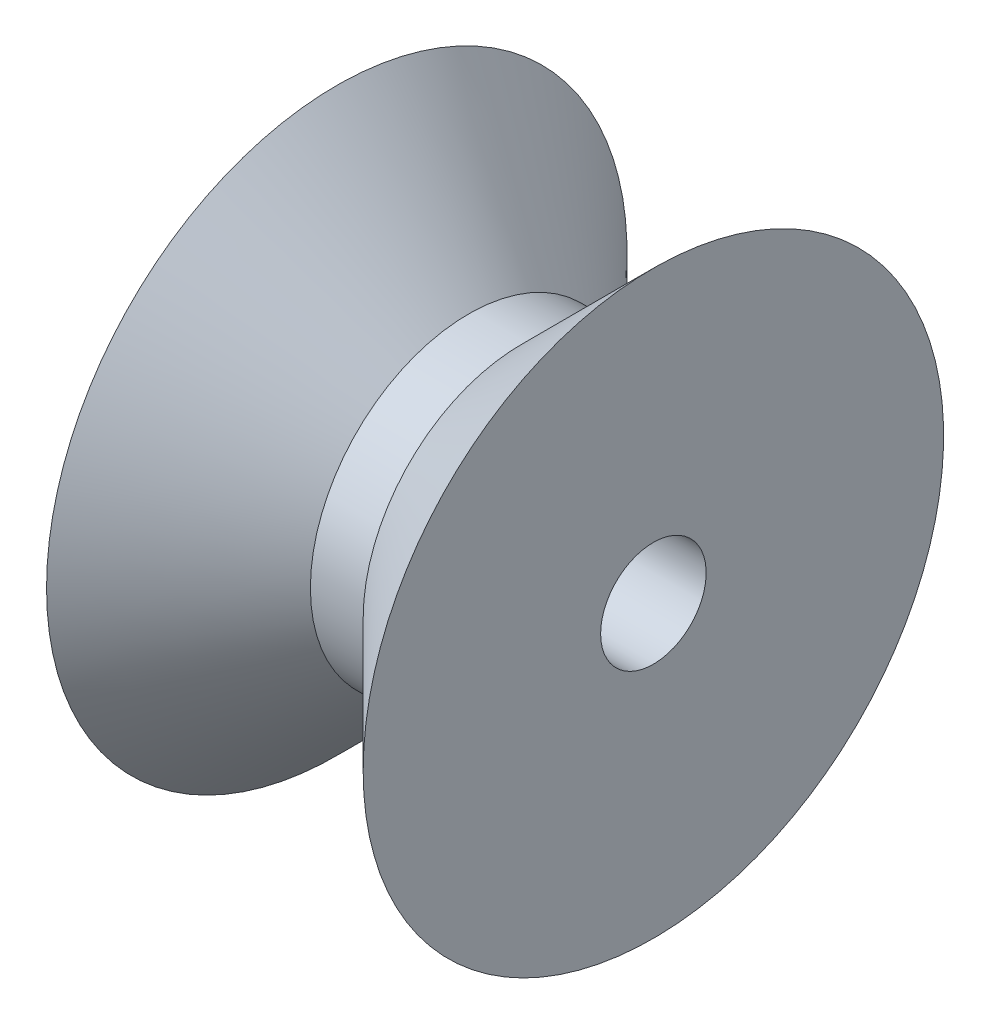
ISO-10303-21;
HEADER;
FILE_DESCRIPTION(('STEP AP214'),'2;1');
FILE_NAME('part.step','',(''),(''),'','','');
FILE_SCHEMA(('AUTOMOTIVE_DESIGN { 1 0 10303 214 1 1 1 1 }'));
ENDSEC;
DATA;
#1=APPLICATION_CONTEXT('core data for automotive mechanical design processes');
#2=APPLICATION_PROTOCOL_DEFINITION('international standard','automotive_design',2000,#1);
#3=PRODUCT_CONTEXT('',#1,'mechanical');
#4=PRODUCT('Part','Part','',(#3));
#5=PRODUCT_RELATED_PRODUCT_CATEGORY('part','',(#4));
#6=PRODUCT_DEFINITION_FORMATION('','',#4);
#7=PRODUCT_DEFINITION_CONTEXT('part definition',#1,'design');
#8=PRODUCT_DEFINITION('design','',#6,#7);
#9=PRODUCT_DEFINITION_SHAPE('','',#8);
#10=(LENGTH_UNIT() NAMED_UNIT(*) SI_UNIT(.MILLI.,.METRE.));
#11=(NAMED_UNIT(*) PLANE_ANGLE_UNIT() SI_UNIT($,.RADIAN.));
#12=(NAMED_UNIT(*) SI_UNIT($,.STERADIAN.) SOLID_ANGLE_UNIT());
#13=UNCERTAINTY_MEASURE_WITH_UNIT(LENGTH_MEASURE(1.E-05),#10,'distance_accuracy_value','');
#14=(GEOMETRIC_REPRESENTATION_CONTEXT(3) GLOBAL_UNCERTAINTY_ASSIGNED_CONTEXT((#13)) GLOBAL_UNIT_ASSIGNED_CONTEXT((#10,
#11,#12)) REPRESENTATION_CONTEXT('',''));
#15=CARTESIAN_POINT('',(0.,0.,0.));
#16=DIRECTION('',(0.,0.,1.));
#17=DIRECTION('',(1.,0.,0.));
#18=AXIS2_PLACEMENT_3D('',#15,#16,#17);
#19=CARTESIAN_POINT('',(6.,0.,0.));
#20=DIRECTION('',(-1.,0.,0.));
#21=DIRECTION('',(0.,0.,1.));
#22=AXIS2_PLACEMENT_3D('',#19,#20,#21);
#23=PLANE('',#22);
#24=CARTESIAN_POINT('',(6.,0.,0.));
#25=DIRECTION('',(-1.,0.,0.));
#26=DIRECTION('',(0.,0.,1.));
#27=AXIS2_PLACEMENT_3D('',#24,#25,#26);
#28=CIRCLE('',#27,2.);
#29=CARTESIAN_POINT('',(6.,0.,2.));
#30=VERTEX_POINT('',#29);
#31=EDGE_CURVE('E50',#30,#30,#28,.T.);
#32=ORIENTED_EDGE('',*,*,#31,.T.);
#33=EDGE_LOOP('',(#32));
#34=FACE_BOUND('',#33,.T.);
#35=CARTESIAN_POINT('',(6.,0.,0.));
#36=DIRECTION('',(-1.,0.,0.));
#37=DIRECTION('',(0.,0.,1.));
#38=AXIS2_PLACEMENT_3D('',#35,#36,#37);
#39=CIRCLE('',#38,11.);
#40=CARTESIAN_POINT('',(6.,0.,11.));
#41=VERTEX_POINT('',#40);
#42=EDGE_CURVE('E45',#41,#41,#39,.T.);
#43=ORIENTED_EDGE('',*,*,#42,.F.);
#44=EDGE_LOOP('',(#43));
#45=FACE_BOUND('',#44,.T.);
#46=ADVANCED_FACE('F31',(#34,#45),#23,.F.);
#47=CARTESIAN_POINT('',(-6.,0.,0.));
#48=DIRECTION('',(-1.,0.,0.));
#49=DIRECTION('',(0.,0.,1.));
#50=AXIS2_PLACEMENT_3D('',#47,#48,#49);
#51=PLANE('',#50);
#52=CARTESIAN_POINT('',(-6.,0.,0.));
#53=DIRECTION('',(-1.,0.,0.));
#54=DIRECTION('',(0.,0.,1.));
#55=AXIS2_PLACEMENT_3D('',#52,#53,#54);
#56=CIRCLE('',#55,2.);
#57=CARTESIAN_POINT('',(-6.,0.,2.));
#58=VERTEX_POINT('',#57);
#59=EDGE_CURVE('E51',#58,#58,#56,.T.);
#60=ORIENTED_EDGE('',*,*,#59,.F.);
#61=EDGE_LOOP('',(#60));
#62=FACE_BOUND('',#61,.T.);
#63=CARTESIAN_POINT('',(-6.,0.,0.));
#64=DIRECTION('',(-1.,0.,0.));
#65=DIRECTION('',(0.,0.,1.));
#66=AXIS2_PLACEMENT_3D('',#63,#64,#65);
#67=CIRCLE('',#66,11.);
#68=CARTESIAN_POINT('',(-6.,0.,11.));
#69=VERTEX_POINT('',#68);
#70=EDGE_CURVE('E10',#69,#69,#67,.T.);
#71=ORIENTED_EDGE('',*,*,#70,.T.);
#72=EDGE_LOOP('',(#71));
#73=FACE_BOUND('',#72,.T.);
#74=ADVANCED_FACE('F66',(#62,#73),#51,.T.);
#75=CARTESIAN_POINT('',(-6.,0.,0.));
#76=DIRECTION('',(-1.,0.,0.));
#77=DIRECTION('',(0.,0.,1.));
#78=AXIS2_PLACEMENT_3D('',#75,#76,#77);
#79=CONICAL_SURFACE('',#78,11.,0.785398163397449);
#80=CARTESIAN_POINT('',(-1.,0.,0.));
#81=DIRECTION('',(-1.,0.,0.));
#82=DIRECTION('',(0.,0.,1.));
#83=AXIS2_PLACEMENT_3D('',#80,#81,#82);
#84=CIRCLE('',#83,6.);
#85=CARTESIAN_POINT('',(-1.,0.,6.));
#86=VERTEX_POINT('',#85);
#87=EDGE_CURVE('E37',#86,#86,#84,.T.);
#88=ORIENTED_EDGE('',*,*,#87,.T.);
#89=EDGE_LOOP('',(#88));
#90=FACE_BOUND('',#89,.T.);
#91=ORIENTED_EDGE('',*,*,#70,.F.);
#92=EDGE_LOOP('',(#91));
#93=FACE_BOUND('',#92,.T.);
#94=ADVANCED_FACE('F68',(#90,#93),#79,.T.);
#95=CARTESIAN_POINT('',(-30.1774580335731,0.,0.));
#96=DIRECTION('',(-1.,0.,0.));
#97=DIRECTION('',(0.,0.,1.));
#98=AXIS2_PLACEMENT_3D('',#95,#96,#97);
#99=CYLINDRICAL_SURFACE('',#98,6.);
#100=CARTESIAN_POINT('',(1.00000000000001,0.,0.));
#101=DIRECTION('',(-1.,0.,0.));
#102=DIRECTION('',(0.,0.,1.));
#103=AXIS2_PLACEMENT_3D('',#100,#101,#102);
#104=CIRCLE('',#103,6.);
#105=CARTESIAN_POINT('',(1.00000000000001,0.,6.));
#106=VERTEX_POINT('',#105);
#107=EDGE_CURVE('E41',#106,#106,#104,.T.);
#108=ORIENTED_EDGE('',*,*,#107,.T.);
#109=EDGE_LOOP('',(#108));
#110=FACE_BOUND('',#109,.T.);
#111=ORIENTED_EDGE('',*,*,#87,.F.);
#112=EDGE_LOOP('',(#111));
#113=FACE_BOUND('',#112,.T.);
#114=ADVANCED_FACE('F73',(#110,#113),#99,.T.);
#115=CARTESIAN_POINT('',(6.,0.,0.));
#116=DIRECTION('',(1.,0.,0.));
#117=DIRECTION('',(0.,0.,-1.));
#118=AXIS2_PLACEMENT_3D('',#115,#116,#117);
#119=CONICAL_SURFACE('',#118,11.,0.785398163397449);
#120=ORIENTED_EDGE('',*,*,#107,.F.);
#121=EDGE_LOOP('',(#120));
#122=FACE_BOUND('',#121,.T.);
#123=ORIENTED_EDGE('',*,*,#42,.T.);
#124=EDGE_LOOP('',(#123));
#125=FACE_BOUND('',#124,.T.);
#126=ADVANCED_FACE('F62',(#122,#125),#119,.T.);
#127=CARTESIAN_POINT('',(6.,0.,0.));
#128=DIRECTION('',(-1.,0.,0.));
#129=DIRECTION('',(0.,0.,1.));
#130=AXIS2_PLACEMENT_3D('',#127,#128,#129);
#131=CYLINDRICAL_SURFACE('',#130,2.);
#132=ORIENTED_EDGE('',*,*,#31,.F.);
#133=EDGE_LOOP('',(#132));
#134=FACE_BOUND('',#133,.T.);
#135=ORIENTED_EDGE('',*,*,#59,.T.);
#136=EDGE_LOOP('',(#135));
#137=FACE_BOUND('',#136,.T.);
#138=ADVANCED_FACE('F59',(#134,#137),#131,.F.);
#139=CLOSED_SHELL('',(#46,#74,#94,#114,#126,#138));
#140=MANIFOLD_SOLID_BREP('B2',#139);
#141=ADVANCED_BREP_SHAPE_REPRESENTATION('',(#18,#140),#14);
#142=SHAPE_DEFINITION_REPRESENTATION(#9,#141);
ENDSEC;
END-ISO-10303-21;
